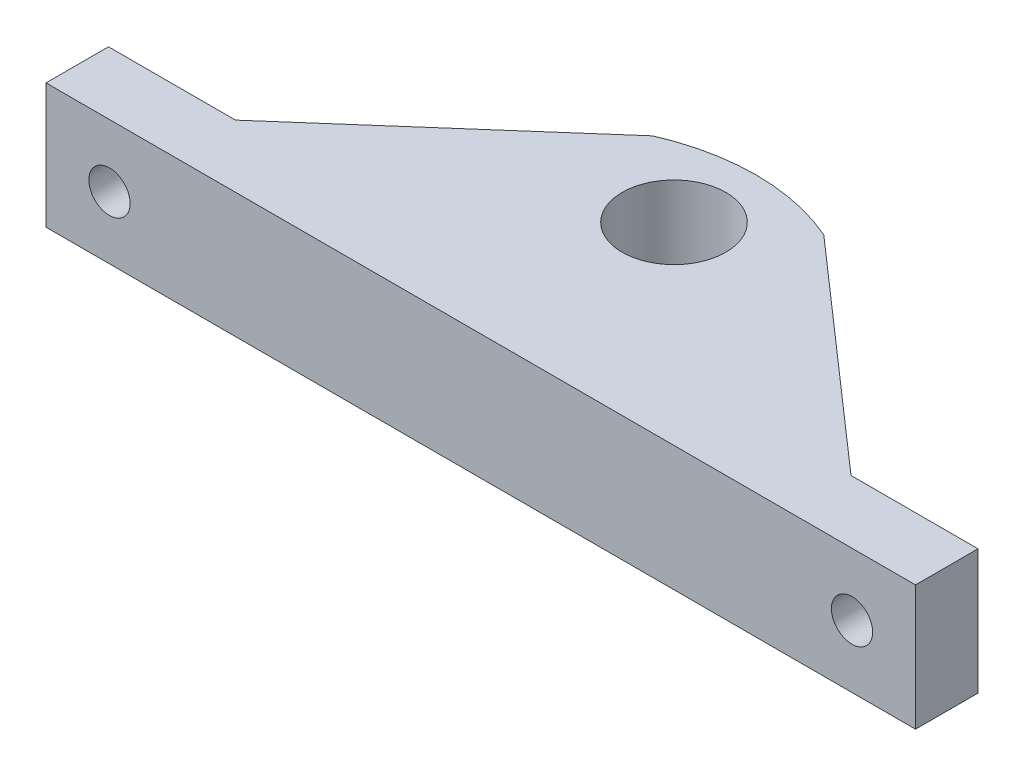
ISO-10303-21;
HEADER;
FILE_DESCRIPTION(('STEP AP214'),'2;1');
FILE_NAME('part.step','',(''),(''),'','','');
FILE_SCHEMA(('AUTOMOTIVE_DESIGN { 1 0 10303 214 1 1 1 1 }'));
ENDSEC;
DATA;
#1=APPLICATION_CONTEXT('core data for automotive mechanical design processes');
#2=APPLICATION_PROTOCOL_DEFINITION('international standard','automotive_design',2000,#1);
#3=PRODUCT_CONTEXT('',#1,'mechanical');
#4=PRODUCT('Part','Part','',(#3));
#5=PRODUCT_RELATED_PRODUCT_CATEGORY('part','',(#4));
#6=PRODUCT_DEFINITION_FORMATION('','',#4);
#7=PRODUCT_DEFINITION_CONTEXT('part definition',#1,'design');
#8=PRODUCT_DEFINITION('design','',#6,#7);
#9=PRODUCT_DEFINITION_SHAPE('','',#8);
#10=(LENGTH_UNIT() NAMED_UNIT(*) SI_UNIT(.MILLI.,.METRE.));
#11=(NAMED_UNIT(*) PLANE_ANGLE_UNIT() SI_UNIT($,.RADIAN.));
#12=(NAMED_UNIT(*) SI_UNIT($,.STERADIAN.) SOLID_ANGLE_UNIT());
#13=UNCERTAINTY_MEASURE_WITH_UNIT(LENGTH_MEASURE(1.E-05),#10,'distance_accuracy_value','');
#14=(GEOMETRIC_REPRESENTATION_CONTEXT(3) GLOBAL_UNCERTAINTY_ASSIGNED_CONTEXT((#13)) GLOBAL_UNIT_ASSIGNED_CONTEXT((#10,
#11,#12)) REPRESENTATION_CONTEXT('',''));
#15=CARTESIAN_POINT('',(0.,0.,0.));
#16=DIRECTION('',(0.,0.,1.));
#17=DIRECTION('',(1.,0.,0.));
#18=AXIS2_PLACEMENT_3D('',#15,#16,#17);
#19=CARTESIAN_POINT('',(0.,0.,0.));
#20=DIRECTION('',(0.,0.,1.));
#21=DIRECTION('',(1.,0.,0.));
#22=AXIS2_PLACEMENT_3D('',#19,#20,#21);
#23=PLANE('',#22);
#24=CARTESIAN_POINT('',(29.70062772674,0.,0.));
#25=DIRECTION('',(0.,0.,-1.));
#26=DIRECTION('',(-1.,0.,0.));
#27=AXIS2_PLACEMENT_3D('',#24,#25,#26);
#28=CIRCLE('',#27,1.65);
#29=CARTESIAN_POINT('',(28.05062772674,0.,0.));
#30=VERTEX_POINT('',#29);
#31=EDGE_CURVE('E179',#30,#30,#28,.T.);
#32=ORIENTED_EDGE('',*,*,#31,.F.);
#33=EDGE_LOOP('',(#32));
#34=FACE_BOUND('',#33,.T.);
#35=DIRECTION('',(0.,-1.,0.));
#36=VECTOR('',#35,1.);
#37=CARTESIAN_POINT('',(24.6212554534801,57.1029710664091,0.));
#38=LINE('',#37,#36);
#39=CARTESIAN_POINT('',(24.6212554534801,5.,0.));
#40=VERTEX_POINT('',#39);
#41=CARTESIAN_POINT('',(24.6212554534801,-5.,0.));
#42=VERTEX_POINT('',#41);
#43=EDGE_CURVE('E56',#40,#42,#38,.T.);
#44=ORIENTED_EDGE('',*,*,#43,.F.);
#45=DIRECTION('',(-1.,0.,0.));
#46=VECTOR('',#45,1.);
#47=CARTESIAN_POINT('',(-34.78,5.,0.));
#48=LINE('',#47,#46);
#49=CARTESIAN_POINT('',(34.78,5.,0.));
#50=VERTEX_POINT('',#49);
#51=EDGE_CURVE('E152',#50,#40,#48,.T.);
#52=ORIENTED_EDGE('',*,*,#51,.F.);
#53=DIRECTION('',(0.,1.,0.));
#54=VECTOR('',#53,1.);
#55=CARTESIAN_POINT('',(34.78,5.,0.));
#56=LINE('',#55,#54);
#57=CARTESIAN_POINT('',(34.78,-5.,0.));
#58=VERTEX_POINT('',#57);
#59=EDGE_CURVE('E137',#58,#50,#56,.T.);
#60=ORIENTED_EDGE('',*,*,#59,.F.);
#61=DIRECTION('',(1.,0.,0.));
#62=VECTOR('',#61,1.);
#63=CARTESIAN_POINT('',(-34.78,-5.,0.));
#64=LINE('',#63,#62);
#65=EDGE_CURVE('E156',#42,#58,#64,.T.);
#66=ORIENTED_EDGE('',*,*,#65,.F.);
#67=EDGE_LOOP('',(#44,#52,#60,#66));
#68=FACE_BOUND('',#67,.T.);
#69=ADVANCED_FACE('F33',(#34,#68),#23,.F.);
#70=CARTESIAN_POINT('',(34.78,5.,5.));
#71=DIRECTION('',(-1.,0.,0.));
#72=DIRECTION('',(0.,0.,1.));
#73=AXIS2_PLACEMENT_3D('',#70,#71,#72);
#74=PLANE('',#73);
#75=ORIENTED_EDGE('',*,*,#59,.T.);
#76=DIRECTION('',(0.,0.,-1.));
#77=VECTOR('',#76,1.);
#78=CARTESIAN_POINT('',(34.78,5.,5.));
#79=LINE('',#78,#77);
#80=CARTESIAN_POINT('',(34.78,5.,5.));
#81=VERTEX_POINT('',#80);
#82=EDGE_CURVE('E11',#81,#50,#79,.T.);
#83=ORIENTED_EDGE('',*,*,#82,.F.);
#84=DIRECTION('',(0.,1.,0.));
#85=VECTOR('',#84,1.);
#86=CARTESIAN_POINT('',(34.78,5.,5.));
#87=LINE('',#86,#85);
#88=CARTESIAN_POINT('',(34.78,-5.,5.));
#89=VERTEX_POINT('',#88);
#90=EDGE_CURVE('E139',#89,#81,#87,.T.);
#91=ORIENTED_EDGE('',*,*,#90,.F.);
#92=DIRECTION('',(0.,0.,-1.));
#93=VECTOR('',#92,1.);
#94=CARTESIAN_POINT('',(34.78,-5.,5.));
#95=LINE('',#94,#93);
#96=EDGE_CURVE('E149',#89,#58,#95,.T.);
#97=ORIENTED_EDGE('',*,*,#96,.T.);
#98=EDGE_LOOP('',(#75,#83,#91,#97));
#99=FACE_BOUND('',#98,.T.);
#100=ADVANCED_FACE('F35',(#99),#74,.F.);
#101=CARTESIAN_POINT('',(-34.78,5.,5.));
#102=DIRECTION('',(0.,-1.,0.));
#103=DIRECTION('',(0.,0.,-1.));
#104=AXIS2_PLACEMENT_3D('',#101,#102,#103);
#105=PLANE('',#104);
#106=ORIENTED_EDGE('',*,*,#51,.T.);
#107=DIRECTION('',(-0.751716144539164,0.,-0.6594867989878));
#108=VECTOR('',#107,1.);
#109=CARTESIAN_POINT('',(6.85754992094086,5.,-15.5842459749191));
#110=LINE('',#109,#108);
#111=CARTESIAN_POINT('',(6.85754992094086,5.,-15.5842459749191));
#112=VERTEX_POINT('',#111);
#113=EDGE_CURVE('E138',#40,#112,#110,.T.);
#114=ORIENTED_EDGE('',*,*,#113,.T.);
#115=CARTESIAN_POINT('',(0.,5.,0.));
#116=DIRECTION('',(0.,-1.,0.));
#117=DIRECTION('',(0.,0.,-1.));
#118=AXIS2_PLACEMENT_3D('',#115,#116,#117);
#119=CIRCLE('',#118,17.0262947679458);
#120=CARTESIAN_POINT('',(-6.85754992094086,5.,-15.5842459749191));
#121=VERTEX_POINT('',#120);
#122=EDGE_CURVE('E106',#112,#121,#119,.F.);
#123=ORIENTED_EDGE('',*,*,#122,.T.);
#124=DIRECTION('',(-0.751716144539164,0.,0.6594867989878));
#125=VECTOR('',#124,1.);
#126=CARTESIAN_POINT('',(-6.85754992094086,5.,-15.5842459749191));
#127=LINE('',#126,#125);
#128=CARTESIAN_POINT('',(-24.6212554534801,5.,0.));
#129=VERTEX_POINT('',#128);
#130=EDGE_CURVE('E130',#121,#129,#127,.T.);
#131=ORIENTED_EDGE('',*,*,#130,.T.);
#132=CARTESIAN_POINT('',(-34.78,5.,0.));
#133=VERTEX_POINT('',#132);
#134=EDGE_CURVE('E48',#129,#133,#48,.T.);
#135=ORIENTED_EDGE('',*,*,#134,.T.);
#136=DIRECTION('',(0.,0.,-1.));
#137=VECTOR('',#136,1.);
#138=CARTESIAN_POINT('',(-34.78,5.,5.));
#139=LINE('',#138,#137);
#140=CARTESIAN_POINT('',(-34.78,5.,5.));
#141=VERTEX_POINT('',#140);
#142=EDGE_CURVE('E41',#141,#133,#139,.T.);
#143=ORIENTED_EDGE('',*,*,#142,.F.);
#144=DIRECTION('',(-1.,0.,0.));
#145=VECTOR('',#144,1.);
#146=CARTESIAN_POINT('',(-34.78,5.,5.));
#147=LINE('',#146,#145);
#148=EDGE_CURVE('E142',#81,#141,#147,.T.);
#149=ORIENTED_EDGE('',*,*,#148,.F.);
#150=ORIENTED_EDGE('',*,*,#82,.T.);
#151=EDGE_LOOP('',(#106,#114,#123,#131,#135,#143,#149,#150));
#152=FACE_BOUND('',#151,.T.);
#153=CARTESIAN_POINT('',(0.,5.,-10.460161878386));
#154=DIRECTION('',(0.,-1.,0.));
#155=DIRECTION('',(0.,0.,-1.));
#156=AXIS2_PLACEMENT_3D('',#153,#154,#155);
#157=CIRCLE('',#156,4.15);
#158=CARTESIAN_POINT('',(0.,5.00000000000001,-14.610161878386));
#159=VERTEX_POINT('',#158);
#160=EDGE_CURVE('E134',#159,#159,#157,.F.);
#161=ORIENTED_EDGE('',*,*,#160,.F.);
#162=EDGE_LOOP('',(#161));
#163=FACE_BOUND('',#162,.T.);
#164=ADVANCED_FACE('F205',(#152,#163),#105,.F.);
#165=CARTESIAN_POINT('',(-34.78,5.,5.));
#166=DIRECTION('',(1.,0.,0.));
#167=DIRECTION('',(0.,0.,-1.));
#168=AXIS2_PLACEMENT_3D('',#165,#166,#167);
#169=PLANE('',#168);
#170=DIRECTION('',(0.,-1.,0.));
#171=VECTOR('',#170,1.);
#172=CARTESIAN_POINT('',(-34.78,5.,0.));
#173=LINE('',#172,#171);
#174=CARTESIAN_POINT('',(-34.78,-5.,0.));
#175=VERTEX_POINT('',#174);
#176=EDGE_CURVE('E154',#133,#175,#173,.T.);
#177=ORIENTED_EDGE('',*,*,#176,.T.);
#178=DIRECTION('',(0.,0.,-1.));
#179=VECTOR('',#178,1.);
#180=CARTESIAN_POINT('',(-34.78,-5.,5.));
#181=LINE('',#180,#179);
#182=CARTESIAN_POINT('',(-34.78,-5.,5.));
#183=VERTEX_POINT('',#182);
#184=EDGE_CURVE('E160',#183,#175,#181,.T.);
#185=ORIENTED_EDGE('',*,*,#184,.F.);
#186=DIRECTION('',(0.,-1.,0.));
#187=VECTOR('',#186,1.);
#188=CARTESIAN_POINT('',(-34.78,5.,5.));
#189=LINE('',#188,#187);
#190=EDGE_CURVE('E145',#141,#183,#189,.T.);
#191=ORIENTED_EDGE('',*,*,#190,.F.);
#192=ORIENTED_EDGE('',*,*,#142,.T.);
#193=EDGE_LOOP('',(#177,#185,#191,#192));
#194=FACE_BOUND('',#193,.T.);
#195=ADVANCED_FACE('F166',(#194),#169,.F.);
#196=CARTESIAN_POINT('',(-34.78,-5.,5.));
#197=DIRECTION('',(0.,1.,0.));
#198=DIRECTION('',(0.,0.,1.));
#199=AXIS2_PLACEMENT_3D('',#196,#197,#198);
#200=PLANE('',#199);
#201=CARTESIAN_POINT('',(-24.6212554534801,-5.,0.));
#202=VERTEX_POINT('',#201);
#203=EDGE_CURVE('E143',#175,#202,#64,.T.);
#204=ORIENTED_EDGE('',*,*,#203,.T.);
#205=DIRECTION('',(0.751716144539164,0.,-0.6594867989878));
#206=VECTOR('',#205,1.);
#207=CARTESIAN_POINT('',(-6.85754992094086,-5.,-15.5842459749191));
#208=LINE('',#207,#206);
#209=CARTESIAN_POINT('',(-6.85754992094086,-5.,-15.5842459749191));
#210=VERTEX_POINT('',#209);
#211=EDGE_CURVE('E109',#202,#210,#208,.T.);
#212=ORIENTED_EDGE('',*,*,#211,.T.);
#213=CARTESIAN_POINT('',(0.,-5.,0.));
#214=DIRECTION('',(0.,-1.,0.));
#215=DIRECTION('',(0.,0.,-1.));
#216=AXIS2_PLACEMENT_3D('',#213,#214,#215);
#217=CIRCLE('',#216,17.0262947679458);
#218=CARTESIAN_POINT('',(6.85754992094086,-5.,-15.5842459749191));
#219=VERTEX_POINT('',#218);
#220=EDGE_CURVE('E104',#210,#219,#217,.T.);
#221=ORIENTED_EDGE('',*,*,#220,.T.);
#222=DIRECTION('',(0.751716144539164,0.,0.6594867989878));
#223=VECTOR('',#222,1.);
#224=CARTESIAN_POINT('',(6.85754992094086,-5.,-15.5842459749191));
#225=LINE('',#224,#223);
#226=EDGE_CURVE('E112',#219,#42,#225,.T.);
#227=ORIENTED_EDGE('',*,*,#226,.T.);
#228=ORIENTED_EDGE('',*,*,#65,.T.);
#229=ORIENTED_EDGE('',*,*,#96,.F.);
#230=DIRECTION('',(1.,0.,0.));
#231=VECTOR('',#230,1.);
#232=CARTESIAN_POINT('',(-34.78,-5.,5.));
#233=LINE('',#232,#231);
#234=EDGE_CURVE('E147',#183,#89,#233,.T.);
#235=ORIENTED_EDGE('',*,*,#234,.F.);
#236=ORIENTED_EDGE('',*,*,#184,.T.);
#237=EDGE_LOOP('',(#204,#212,#221,#227,#228,#229,#235,#236));
#238=FACE_BOUND('',#237,.T.);
#239=CARTESIAN_POINT('',(0.,-5.,-10.460161878386));
#240=DIRECTION('',(0.,-1.,0.));
#241=DIRECTION('',(0.,0.,-1.));
#242=AXIS2_PLACEMENT_3D('',#239,#240,#241);
#243=CIRCLE('',#242,4.15);
#244=CARTESIAN_POINT('',(0.,-5.,-14.610161878386));
#245=VERTEX_POINT('',#244);
#246=EDGE_CURVE('E120',#245,#245,#243,.T.);
#247=ORIENTED_EDGE('',*,*,#246,.F.);
#248=EDGE_LOOP('',(#247));
#249=FACE_BOUND('',#248,.T.);
#250=ADVANCED_FACE('F117',(#238,#249),#200,.F.);
#251=CARTESIAN_POINT('',(0.,0.,5.));
#252=DIRECTION('',(0.,0.,1.));
#253=DIRECTION('',(1.,0.,0.));
#254=AXIS2_PLACEMENT_3D('',#251,#252,#253);
#255=PLANE('',#254);
#256=CARTESIAN_POINT('',(-29.70062772674,0.,5.));
#257=DIRECTION('',(0.,0.,1.));
#258=DIRECTION('',(1.,0.,0.));
#259=AXIS2_PLACEMENT_3D('',#256,#257,#258);
#260=CIRCLE('',#259,1.65);
#261=CARTESIAN_POINT('',(-28.05062772674,0.,5.));
#262=VERTEX_POINT('',#261);
#263=EDGE_CURVE('E182',#262,#262,#260,.T.);
#264=ORIENTED_EDGE('',*,*,#263,.F.);
#265=EDGE_LOOP('',(#264));
#266=FACE_BOUND('',#265,.T.);
#267=CARTESIAN_POINT('',(29.70062772674,0.,5.));
#268=DIRECTION('',(0.,0.,-1.));
#269=DIRECTION('',(-1.,0.,0.));
#270=AXIS2_PLACEMENT_3D('',#267,#268,#269);
#271=CIRCLE('',#270,1.65);
#272=CARTESIAN_POINT('',(28.05062772674,0.,5.));
#273=VERTEX_POINT('',#272);
#274=EDGE_CURVE('E123',#273,#273,#271,.T.);
#275=ORIENTED_EDGE('',*,*,#274,.T.);
#276=EDGE_LOOP('',(#275));
#277=FACE_BOUND('',#276,.T.);
#278=ORIENTED_EDGE('',*,*,#90,.T.);
#279=ORIENTED_EDGE('',*,*,#148,.T.);
#280=ORIENTED_EDGE('',*,*,#190,.T.);
#281=ORIENTED_EDGE('',*,*,#234,.T.);
#282=EDGE_LOOP('',(#278,#279,#280,#281));
#283=FACE_BOUND('',#282,.T.);
#284=ADVANCED_FACE('F194',(#266,#277,#283),#255,.T.);
#285=CARTESIAN_POINT('',(-29.70062772674,0.,0.));
#286=DIRECTION('',(0.,0.,1.));
#287=DIRECTION('',(1.,0.,0.));
#288=AXIS2_PLACEMENT_3D('',#285,#286,#287);
#289=CIRCLE('',#288,1.65);
#290=CARTESIAN_POINT('',(-28.05062772674,0.,0.));
#291=VERTEX_POINT('',#290);
#292=EDGE_CURVE('E185',#291,#291,#289,.T.);
#293=ORIENTED_EDGE('',*,*,#292,.T.);
#294=EDGE_LOOP('',(#293));
#295=FACE_BOUND('',#294,.T.);
#296=ORIENTED_EDGE('',*,*,#134,.F.);
#297=DIRECTION('',(0.,-1.,0.));
#298=VECTOR('',#297,1.);
#299=CARTESIAN_POINT('',(-24.6212554534801,57.1029710664091,0.));
#300=LINE('',#299,#298);
#301=EDGE_CURVE('E131',#129,#202,#300,.T.);
#302=ORIENTED_EDGE('',*,*,#301,.T.);
#303=ORIENTED_EDGE('',*,*,#203,.F.);
#304=ORIENTED_EDGE('',*,*,#176,.F.);
#305=EDGE_LOOP('',(#296,#302,#303,#304));
#306=FACE_BOUND('',#305,.T.);
#307=ADVANCED_FACE('F170',(#295,#306),#23,.F.);
#308=CARTESIAN_POINT('',(6.85754992094086,57.1029710664091,-15.5842459749191));
#309=DIRECTION('',(0.6594867989878,0.,-0.751716144539163));
#310=DIRECTION('',(-0.751716144539164,0.,-0.6594867989878));
#311=AXIS2_PLACEMENT_3D('',#308,#309,#310);
#312=PLANE('',#311);
#313=ORIENTED_EDGE('',*,*,#113,.F.);
#314=ORIENTED_EDGE('',*,*,#43,.T.);
#315=ORIENTED_EDGE('',*,*,#226,.F.);
#316=DIRECTION('',(0.,-1.,0.));
#317=VECTOR('',#316,1.);
#318=CARTESIAN_POINT('',(6.85754992094086,57.1029710664091,-15.5842459749191));
#319=LINE('',#318,#317);
#320=EDGE_CURVE('E99',#112,#219,#319,.T.);
#321=ORIENTED_EDGE('',*,*,#320,.F.);
#322=EDGE_LOOP('',(#313,#314,#315,#321));
#323=FACE_BOUND('',#322,.T.);
#324=ADVANCED_FACE('F113',(#323),#312,.T.);
#325=CARTESIAN_POINT('',(-6.85754992094086,57.1029710664091,-15.5842459749191));
#326=DIRECTION('',(-0.6594867989878,0.,-0.751716144539164));
#327=DIRECTION('',(-0.751716144539164,0.,0.6594867989878));
#328=AXIS2_PLACEMENT_3D('',#325,#326,#327);
#329=PLANE('',#328);
#330=ORIENTED_EDGE('',*,*,#130,.F.);
#331=DIRECTION('',(0.,-1.,0.));
#332=VECTOR('',#331,1.);
#333=CARTESIAN_POINT('',(-6.85754992094086,57.1029710664091,-15.5842459749191));
#334=LINE('',#333,#332);
#335=EDGE_CURVE('E128',#121,#210,#334,.T.);
#336=ORIENTED_EDGE('',*,*,#335,.T.);
#337=ORIENTED_EDGE('',*,*,#211,.F.);
#338=ORIENTED_EDGE('',*,*,#301,.F.);
#339=EDGE_LOOP('',(#330,#336,#337,#338));
#340=FACE_BOUND('',#339,.T.);
#341=ADVANCED_FACE('F175',(#340),#329,.T.);
#342=CARTESIAN_POINT('',(0.,57.1029710664091,0.));
#343=DIRECTION('',(0.,-1.,0.));
#344=DIRECTION('',(0.,0.,-1.));
#345=AXIS2_PLACEMENT_3D('',#342,#343,#344);
#346=CYLINDRICAL_SURFACE('',#345,17.0262947679458);
#347=ORIENTED_EDGE('',*,*,#122,.F.);
#348=ORIENTED_EDGE('',*,*,#320,.T.);
#349=ORIENTED_EDGE('',*,*,#220,.F.);
#350=ORIENTED_EDGE('',*,*,#335,.F.);
#351=EDGE_LOOP('',(#347,#348,#349,#350));
#352=FACE_BOUND('',#351,.T.);
#353=ADVANCED_FACE('F101',(#352),#346,.T.);
#354=CARTESIAN_POINT('',(0.,57.1029710664091,-10.460161878386));
#355=DIRECTION('',(0.,-1.,0.));
#356=DIRECTION('',(0.,0.,-1.));
#357=AXIS2_PLACEMENT_3D('',#354,#355,#356);
#358=CYLINDRICAL_SURFACE('',#357,4.15);
#359=CARTESIAN_POINT('',(0.,5.00000000000001,-14.610161878386));
#360=CARTESIAN_POINT('',(0.,4.89583333333334,-14.610161878386));
#361=CARTESIAN_POINT('',(0.,4.79166666666668,-14.610161878386));
#362=CARTESIAN_POINT('',(0.,4.58333333333334,-14.610161878386));
#363=CARTESIAN_POINT('',(0.,4.47916666666668,-14.610161878386));
#364=CARTESIAN_POINT('',(0.,4.27083333333334,-14.610161878386));
#365=CARTESIAN_POINT('',(0.,4.16666666666668,-14.610161878386));
#366=CARTESIAN_POINT('',(0.,3.95833333333334,-14.610161878386));
#367=CARTESIAN_POINT('',(0.,3.85416666666668,-14.610161878386));
#368=CARTESIAN_POINT('',(0.,3.64583333333334,-14.610161878386));
#369=CARTESIAN_POINT('',(0.,3.54166666666668,-14.610161878386));
#370=CARTESIAN_POINT('',(0.,3.33333333333334,-14.610161878386));
#371=CARTESIAN_POINT('',(0.,3.22916666666668,-14.610161878386));
#372=CARTESIAN_POINT('',(0.,3.02083333333334,-14.610161878386));
#373=CARTESIAN_POINT('',(0.,2.91666666666668,-14.610161878386));
#374=CARTESIAN_POINT('',(0.,2.70833333333334,-14.610161878386));
#375=CARTESIAN_POINT('',(0.,2.60416666666668,-14.610161878386));
#376=CARTESIAN_POINT('',(0.,2.39583333333334,-14.610161878386));
#377=CARTESIAN_POINT('',(0.,2.29166666666668,-14.610161878386));
#378=CARTESIAN_POINT('',(0.,2.08333333333334,-14.610161878386));
#379=CARTESIAN_POINT('',(0.,1.97916666666668,-14.610161878386));
#380=CARTESIAN_POINT('',(0.,1.77083333333334,-14.610161878386));
#381=CARTESIAN_POINT('',(0.,1.66666666666667,-14.610161878386));
#382=CARTESIAN_POINT('',(0.,1.45833333333334,-14.610161878386));
#383=CARTESIAN_POINT('',(0.,1.35416666666667,-14.610161878386));
#384=CARTESIAN_POINT('',(0.,1.14583333333334,-14.610161878386));
#385=CARTESIAN_POINT('',(0.,1.04166666666667,-14.610161878386));
#386=CARTESIAN_POINT('',(0.,0.833333333333341,-14.610161878386));
#387=CARTESIAN_POINT('',(0.,0.729166666666674,-14.610161878386));
#388=CARTESIAN_POINT('',(0.,0.520833333333341,-14.610161878386));
#389=CARTESIAN_POINT('',(0.,0.416666666666674,-14.610161878386));
#390=CARTESIAN_POINT('',(0.,0.20833333333334,-14.610161878386));
#391=CARTESIAN_POINT('',(0.,0.104166666666674,-14.610161878386));
#392=CARTESIAN_POINT('',(0.,-0.10416666666666,-14.610161878386));
#393=CARTESIAN_POINT('',(0.,-0.208333333333327,-14.610161878386));
#394=CARTESIAN_POINT('',(0.,-0.41666666666666,-14.610161878386));
#395=CARTESIAN_POINT('',(0.,-0.520833333333327,-14.610161878386));
#396=CARTESIAN_POINT('',(0.,-0.72916666666666,-14.610161878386));
#397=CARTESIAN_POINT('',(0.,-0.833333333333327,-14.610161878386));
#398=CARTESIAN_POINT('',(0.,-1.04166666666666,-14.610161878386));
#399=CARTESIAN_POINT('',(0.,-1.14583333333333,-14.610161878386));
#400=CARTESIAN_POINT('',(0.,-1.35416666666666,-14.610161878386));
#401=CARTESIAN_POINT('',(0.,-1.45833333333333,-14.610161878386));
#402=CARTESIAN_POINT('',(0.,-1.66666666666666,-14.610161878386));
#403=CARTESIAN_POINT('',(0.,-1.77083333333333,-14.610161878386));
#404=CARTESIAN_POINT('',(0.,-1.97916666666666,-14.610161878386));
#405=CARTESIAN_POINT('',(0.,-2.08333333333333,-14.610161878386));
#406=CARTESIAN_POINT('',(0.,-2.29166666666666,-14.610161878386));
#407=CARTESIAN_POINT('',(0.,-2.39583333333333,-14.610161878386));
#408=CARTESIAN_POINT('',(0.,-2.60416666666666,-14.610161878386));
#409=CARTESIAN_POINT('',(0.,-2.70833333333333,-14.610161878386));
#410=CARTESIAN_POINT('',(0.,-2.91666666666666,-14.610161878386));
#411=CARTESIAN_POINT('',(0.,-3.02083333333333,-14.610161878386));
#412=CARTESIAN_POINT('',(0.,-3.22916666666666,-14.610161878386));
#413=CARTESIAN_POINT('',(0.,-3.33333333333333,-14.610161878386));
#414=CARTESIAN_POINT('',(0.,-3.54166666666666,-14.610161878386));
#415=CARTESIAN_POINT('',(0.,-3.64583333333333,-14.610161878386));
#416=CARTESIAN_POINT('',(0.,-3.85416666666666,-14.610161878386));
#417=CARTESIAN_POINT('',(0.,-3.95833333333333,-14.610161878386));
#418=CARTESIAN_POINT('',(0.,-4.16666666666666,-14.610161878386));
#419=CARTESIAN_POINT('',(0.,-4.27083333333333,-14.610161878386));
#420=CARTESIAN_POINT('',(0.,-4.47916666666666,-14.610161878386));
#421=CARTESIAN_POINT('',(0.,-4.58333333333333,-14.610161878386));
#422=CARTESIAN_POINT('',(0.,-4.79166666666666,-14.610161878386));
#423=CARTESIAN_POINT('',(0.,-4.89583333333333,-14.610161878386));
#424=CARTESIAN_POINT('',(0.,-5.,-14.610161878386));
#425=B_SPLINE_CURVE_WITH_KNOTS('',3,(#359,#360,#361,#362,#363,#364,#365,#366,#367,#368,#369,
#370,#371,#372,#373,#374,#375,#376,#377,#378,#379,#380,#381,#382,#383,#384,#385,#386,#387,#388,
#389,#390,#391,#392,#393,#394,#395,#396,#397,#398,#399,#400,#401,#402,#403,#404,#405,#406,#407,
#408,#409,#410,#411,#412,#413,#414,#415,#416,#417,#418,#419,#420,#421,#422,#423,#424),
.UNSPECIFIED.,.F.,.F.,(4,2,2,2,2,2,2,2,2,2,2,2,2,2,2,2,2,2,2,2,2,2,2,2,2,2,2,2,2,2,2,2,4),(0.,
0.3125,0.625000000000001,0.937500000000001,1.25,1.5625,1.875,2.1875,2.5,2.8125,3.125,3.4375,
3.75,4.0625,4.375,4.6875,5.,5.3125,5.62500000000001,5.93750000000001,6.25000000000001,
6.56250000000001,6.87500000000001,7.18750000000001,7.50000000000001,7.81250000000001,
8.12500000000001,8.43750000000001,8.75000000000001,9.06250000000001,9.37500000000001,
9.68750000000001,10.),.UNSPECIFIED.);
#426=EDGE_CURVE('BSEAM228',#159,#245,#425,.T.);
#427=ORIENTED_EDGE('',*,*,#160,.T.);
#428=ORIENTED_EDGE('',*,*,#246,.T.);
#429=ORIENTED_EDGE('',*,*,#426,.T.);
#430=ORIENTED_EDGE('',*,*,#426,.F.);
#431=EDGE_LOOP('',(#427,#429,#428,#430));
#432=FACE_BOUND('',#431,.T.);
#433=ADVANCED_FACE('F228',(#432),#358,.F.);
#434=CARTESIAN_POINT('',(29.70062772674,0.,5.));
#435=DIRECTION('',(0.,0.,-1.));
#436=DIRECTION('',(-1.,0.,0.));
#437=AXIS2_PLACEMENT_3D('',#434,#435,#436);
#438=CYLINDRICAL_SURFACE('',#437,1.65);
#439=ORIENTED_EDGE('',*,*,#274,.F.);
#440=EDGE_LOOP('',(#439));
#441=FACE_BOUND('',#440,.T.);
#442=ORIENTED_EDGE('',*,*,#31,.T.);
#443=EDGE_LOOP('',(#442));
#444=FACE_BOUND('',#443,.T.);
#445=ADVANCED_FACE('F223',(#441,#444),#438,.F.);
#446=CARTESIAN_POINT('',(-29.70062772674,0.,5.));
#447=DIRECTION('',(0.,0.,-1.));
#448=DIRECTION('',(-1.,0.,0.));
#449=AXIS2_PLACEMENT_3D('',#446,#447,#448);
#450=CYLINDRICAL_SURFACE('',#449,1.65);
#451=ORIENTED_EDGE('',*,*,#263,.T.);
#452=EDGE_LOOP('',(#451));
#453=FACE_BOUND('',#452,.T.);
#454=ORIENTED_EDGE('',*,*,#292,.F.);
#455=EDGE_LOOP('',(#454));
#456=FACE_BOUND('',#455,.T.);
#457=ADVANCED_FACE('F191',(#453,#456),#450,.F.);
#458=CLOSED_SHELL('',(#69,#100,#164,#195,#250,#284,#307,#324,#341,#353,#433,#445,#457));
#459=MANIFOLD_SOLID_BREP('B2',#458);
#460=ADVANCED_BREP_SHAPE_REPRESENTATION('',(#18,#459),#14);
#461=SHAPE_DEFINITION_REPRESENTATION(#9,#460);
ENDSEC;
END-ISO-10303-21;
